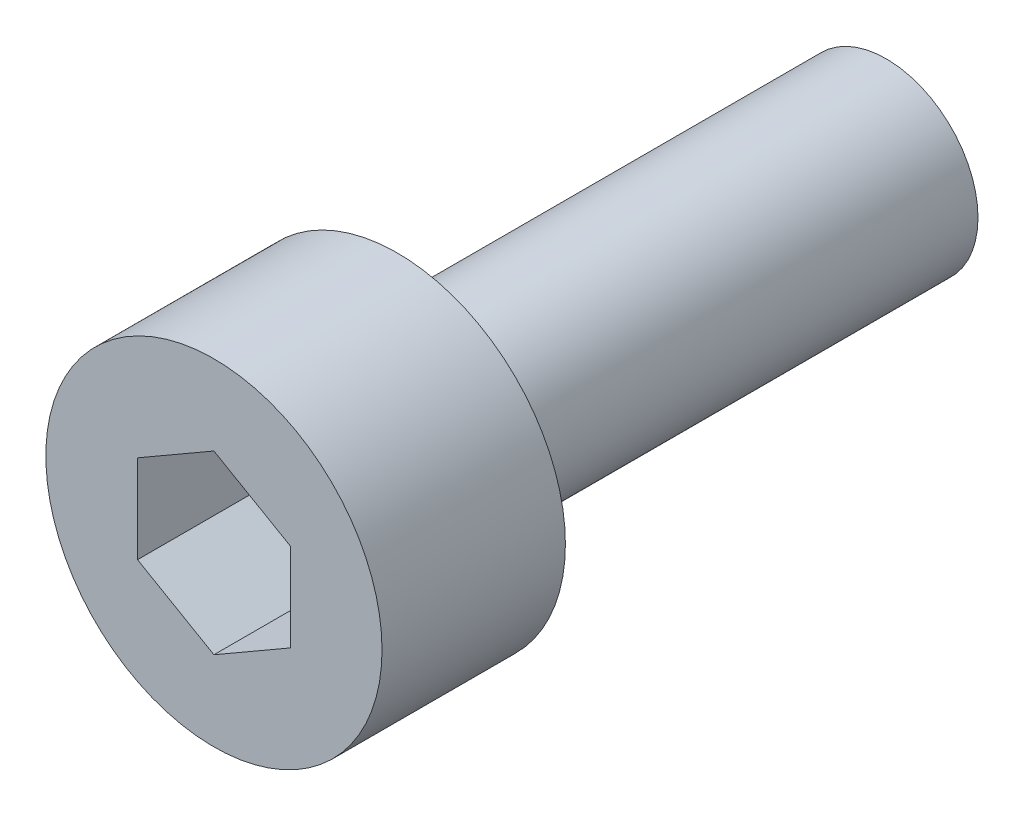
ISO-10303-21;
HEADER;
FILE_DESCRIPTION(('STEP AP214'),'2;1');
FILE_NAME('part.step','',(''),(''),'','','');
FILE_SCHEMA(('AUTOMOTIVE_DESIGN { 1 0 10303 214 1 1 1 1 }'));
ENDSEC;
DATA;
#1=APPLICATION_CONTEXT('core data for automotive mechanical design processes');
#2=APPLICATION_PROTOCOL_DEFINITION('international standard','automotive_design',2000,#1);
#3=PRODUCT_CONTEXT('',#1,'mechanical');
#4=PRODUCT('Part','Part','',(#3));
#5=PRODUCT_RELATED_PRODUCT_CATEGORY('part','',(#4));
#6=PRODUCT_DEFINITION_FORMATION('','',#4);
#7=PRODUCT_DEFINITION_CONTEXT('part definition',#1,'design');
#8=PRODUCT_DEFINITION('design','',#6,#7);
#9=PRODUCT_DEFINITION_SHAPE('','',#8);
#10=(LENGTH_UNIT() NAMED_UNIT(*) SI_UNIT(.MILLI.,.METRE.));
#11=(NAMED_UNIT(*) PLANE_ANGLE_UNIT() SI_UNIT($,.RADIAN.));
#12=(NAMED_UNIT(*) SI_UNIT($,.STERADIAN.) SOLID_ANGLE_UNIT());
#13=UNCERTAINTY_MEASURE_WITH_UNIT(LENGTH_MEASURE(1.E-05),#10,'distance_accuracy_value','');
#14=(GEOMETRIC_REPRESENTATION_CONTEXT(3) GLOBAL_UNCERTAINTY_ASSIGNED_CONTEXT((#13)) GLOBAL_UNIT_ASSIGNED_CONTEXT((#10,
#11,#12)) REPRESENTATION_CONTEXT('',''));
#15=CARTESIAN_POINT('',(0.,0.,0.));
#16=DIRECTION('',(0.,0.,1.));
#17=DIRECTION('',(1.,0.,0.));
#18=AXIS2_PLACEMENT_3D('',#15,#16,#17);
#19=CARTESIAN_POINT('',(0.,0.,0.));
#20=DIRECTION('',(0.,0.,-1.));
#21=DIRECTION('',(-1.,0.,0.));
#22=AXIS2_PLACEMENT_3D('',#19,#20,#21);
#23=CYLINDRICAL_SURFACE('',#22,1.5);
#24=CARTESIAN_POINT('',(0.,0.,0.));
#25=DIRECTION('',(0.,0.,1.));
#26=DIRECTION('',(1.,0.,0.));
#27=AXIS2_PLACEMENT_3D('',#24,#25,#26);
#28=CIRCLE('',#27,1.5);
#29=CARTESIAN_POINT('',(1.5,0.,0.));
#30=VERTEX_POINT('',#29);
#31=EDGE_CURVE('E11',#30,#30,#28,.T.);
#32=ORIENTED_EDGE('',*,*,#31,.F.);
#33=EDGE_LOOP('',(#32));
#34=FACE_BOUND('',#33,.T.);
#35=CARTESIAN_POINT('',(0.,0.,-8.));
#36=DIRECTION('',(0.,0.,1.));
#37=DIRECTION('',(1.,0.,0.));
#38=AXIS2_PLACEMENT_3D('',#35,#36,#37);
#39=CIRCLE('',#38,1.5);
#40=CARTESIAN_POINT('',(1.5,0.,-8.));
#41=VERTEX_POINT('',#40);
#42=EDGE_CURVE('E46',#41,#41,#39,.T.);
#43=ORIENTED_EDGE('',*,*,#42,.T.);
#44=EDGE_LOOP('',(#43));
#45=FACE_BOUND('',#44,.T.);
#46=ADVANCED_FACE('F43',(#34,#45),#23,.T.);
#47=CARTESIAN_POINT('',(0.,0.,-8.));
#48=DIRECTION('',(0.,0.,1.));
#49=DIRECTION('',(1.,0.,0.));
#50=AXIS2_PLACEMENT_3D('',#47,#48,#49);
#51=PLANE('',#50);
#52=ORIENTED_EDGE('',*,*,#42,.F.);
#53=EDGE_LOOP('',(#52));
#54=FACE_BOUND('',#53,.T.);
#55=ADVANCED_FACE('F164',(#54),#51,.F.);
#56=CARTESIAN_POINT('',(0.,0.,3.));
#57=DIRECTION('',(0.,0.,1.));
#58=DIRECTION('',(1.,0.,0.));
#59=AXIS2_PLACEMENT_3D('',#56,#57,#58);
#60=PLANE('',#59);
#61=CARTESIAN_POINT('',(0.,0.,3.));
#62=DIRECTION('',(0.,0.,1.));
#63=DIRECTION('',(1.,0.,0.));
#64=AXIS2_PLACEMENT_3D('',#61,#62,#63);
#65=CIRCLE('',#64,2.75);
#66=CARTESIAN_POINT('',(2.75,0.,3.));
#67=VERTEX_POINT('',#66);
#68=EDGE_CURVE('E146',#67,#67,#65,.T.);
#69=ORIENTED_EDGE('',*,*,#68,.T.);
#70=EDGE_LOOP('',(#69));
#71=FACE_BOUND('',#70,.T.);
#72=DIRECTION('',(-0.866025403784439,0.5,0.));
#73=VECTOR('',#72,1.);
#74=CARTESIAN_POINT('',(1.25,0.721687836487032,3.));
#75=LINE('',#74,#73);
#76=CARTESIAN_POINT('',(1.25,0.721687836487032,3.));
#77=VERTEX_POINT('',#76);
#78=CARTESIAN_POINT('',(0.,1.44337567297406,3.));
#79=VERTEX_POINT('',#78);
#80=EDGE_CURVE('E103',#77,#79,#75,.T.);
#81=ORIENTED_EDGE('',*,*,#80,.F.);
#82=DIRECTION('',(0.,1.,0.));
#83=VECTOR('',#82,1.);
#84=CARTESIAN_POINT('',(1.25,-0.721687836487033,3.));
#85=LINE('',#84,#83);
#86=CARTESIAN_POINT('',(1.25,-0.721687836487033,3.));
#87=VERTEX_POINT('',#86);
#88=EDGE_CURVE('E94',#87,#77,#85,.T.);
#89=ORIENTED_EDGE('',*,*,#88,.F.);
#90=DIRECTION('',(0.866025403784439,0.5,0.));
#91=VECTOR('',#90,1.);
#92=CARTESIAN_POINT('',(0.,-1.44337567297406,3.));
#93=LINE('',#92,#91);
#94=CARTESIAN_POINT('',(0.,-1.44337567297406,3.));
#95=VERTEX_POINT('',#94);
#96=EDGE_CURVE('E124',#95,#87,#93,.T.);
#97=ORIENTED_EDGE('',*,*,#96,.F.);
#98=DIRECTION('',(0.866025403784439,-0.5,0.));
#99=VECTOR('',#98,1.);
#100=CARTESIAN_POINT('',(-1.25,-0.721687836487032,3.));
#101=LINE('',#100,#99);
#102=CARTESIAN_POINT('',(-1.25,-0.721687836487032,3.));
#103=VERTEX_POINT('',#102);
#104=EDGE_CURVE('E121',#103,#95,#101,.T.);
#105=ORIENTED_EDGE('',*,*,#104,.F.);
#106=DIRECTION('',(0.,-1.,0.));
#107=VECTOR('',#106,1.);
#108=CARTESIAN_POINT('',(-1.25,0.721687836487032,3.));
#109=LINE('',#108,#107);
#110=CARTESIAN_POINT('',(-1.25,0.721687836487032,3.));
#111=VERTEX_POINT('',#110);
#112=EDGE_CURVE('E117',#111,#103,#109,.T.);
#113=ORIENTED_EDGE('',*,*,#112,.F.);
#114=DIRECTION('',(-0.866025403784439,-0.5,0.));
#115=VECTOR('',#114,1.);
#116=CARTESIAN_POINT('',(0.,1.44337567297406,3.));
#117=LINE('',#116,#115);
#118=EDGE_CURVE('E115',#79,#111,#117,.T.);
#119=ORIENTED_EDGE('',*,*,#118,.F.);
#120=EDGE_LOOP('',(#81,#89,#97,#105,#113,#119));
#121=FACE_BOUND('',#120,.T.);
#122=ADVANCED_FACE('F113',(#71,#121),#60,.T.);
#123=CARTESIAN_POINT('',(0.,0.,0.));
#124=DIRECTION('',(0.,0.,1.));
#125=DIRECTION('',(1.,0.,0.));
#126=AXIS2_PLACEMENT_3D('',#123,#124,#125);
#127=PLANE('',#126);
#128=ORIENTED_EDGE('',*,*,#31,.T.);
#129=EDGE_LOOP('',(#128));
#130=FACE_BOUND('',#129,.T.);
#131=CARTESIAN_POINT('',(0.,0.,0.));
#132=DIRECTION('',(0.,0.,1.));
#133=DIRECTION('',(1.,0.,0.));
#134=AXIS2_PLACEMENT_3D('',#131,#132,#133);
#135=CIRCLE('',#134,2.75);
#136=CARTESIAN_POINT('',(2.75,0.,0.));
#137=VERTEX_POINT('',#136);
#138=EDGE_CURVE('E109',#137,#137,#135,.T.);
#139=ORIENTED_EDGE('',*,*,#138,.F.);
#140=EDGE_LOOP('',(#139));
#141=FACE_BOUND('',#140,.T.);
#142=ADVANCED_FACE('F154',(#130,#141),#127,.F.);
#143=CARTESIAN_POINT('',(0.,0.,3.));
#144=DIRECTION('',(0.,0.,-1.));
#145=DIRECTION('',(-1.,0.,0.));
#146=AXIS2_PLACEMENT_3D('',#143,#144,#145);
#147=CYLINDRICAL_SURFACE('',#146,2.75);
#148=ORIENTED_EDGE('',*,*,#68,.F.);
#149=EDGE_LOOP('',(#148));
#150=FACE_BOUND('',#149,.T.);
#151=ORIENTED_EDGE('',*,*,#138,.T.);
#152=EDGE_LOOP('',(#151));
#153=FACE_BOUND('',#152,.T.);
#154=ADVANCED_FACE('F152',(#150,#153),#147,.T.);
#155=CARTESIAN_POINT('',(1.25,-0.721687836487033,3.));
#156=DIRECTION('',(-1.,0.,0.));
#157=DIRECTION('',(0.,-1.,0.));
#158=AXIS2_PLACEMENT_3D('',#155,#156,#157);
#159=PLANE('',#158);
#160=DIRECTION('',(0.,1.,0.));
#161=VECTOR('',#160,1.);
#162=CARTESIAN_POINT('',(1.25,-0.721687836487033,0.));
#163=LINE('',#162,#161);
#164=CARTESIAN_POINT('',(1.25,-0.721687836487033,0.));
#165=VERTEX_POINT('',#164);
#166=CARTESIAN_POINT('',(1.25,0.721687836487032,0.));
#167=VERTEX_POINT('',#166);
#168=EDGE_CURVE('E57',#165,#167,#163,.T.);
#169=ORIENTED_EDGE('',*,*,#168,.F.);
#170=DIRECTION('',(0.,0.,-1.));
#171=VECTOR('',#170,1.);
#172=CARTESIAN_POINT('',(1.25,-0.721687836487033,3.));
#173=LINE('',#172,#171);
#174=EDGE_CURVE('E99',#87,#165,#173,.T.);
#175=ORIENTED_EDGE('',*,*,#174,.F.);
#176=ORIENTED_EDGE('',*,*,#88,.T.);
#177=DIRECTION('',(0.,0.,-1.));
#178=VECTOR('',#177,1.);
#179=CARTESIAN_POINT('',(1.25,0.721687836487032,3.));
#180=LINE('',#179,#178);
#181=EDGE_CURVE('E97',#77,#167,#180,.T.);
#182=ORIENTED_EDGE('',*,*,#181,.T.);
#183=EDGE_LOOP('',(#169,#175,#176,#182));
#184=FACE_BOUND('',#183,.T.);
#185=ADVANCED_FACE('F96',(#184),#159,.T.);
#186=CARTESIAN_POINT('',(1.25,0.721687836487032,3.));
#187=DIRECTION('',(-0.5,-0.866025403784439,0.));
#188=DIRECTION('',(0.866025403784439,-0.5,0.));
#189=AXIS2_PLACEMENT_3D('',#186,#187,#188);
#190=PLANE('',#189);
#191=DIRECTION('',(-0.866025403784439,0.5,0.));
#192=VECTOR('',#191,1.);
#193=CARTESIAN_POINT('',(1.25,0.721687836487032,0.));
#194=LINE('',#193,#192);
#195=CARTESIAN_POINT('',(0.,1.44337567297406,0.));
#196=VERTEX_POINT('',#195);
#197=EDGE_CURVE('E61',#167,#196,#194,.T.);
#198=ORIENTED_EDGE('',*,*,#197,.F.);
#199=ORIENTED_EDGE('',*,*,#181,.F.);
#200=ORIENTED_EDGE('',*,*,#80,.T.);
#201=DIRECTION('',(0.,0.,-1.));
#202=VECTOR('',#201,1.);
#203=CARTESIAN_POINT('',(0.,1.44337567297406,3.));
#204=LINE('',#203,#202);
#205=EDGE_CURVE('E110',#79,#196,#204,.T.);
#206=ORIENTED_EDGE('',*,*,#205,.T.);
#207=EDGE_LOOP('',(#198,#199,#200,#206));
#208=FACE_BOUND('',#207,.T.);
#209=ADVANCED_FACE('F107',(#208),#190,.T.);
#210=CARTESIAN_POINT('',(0.,1.44337567297406,3.));
#211=DIRECTION('',(0.5,-0.866025403784439,0.));
#212=DIRECTION('',(0.866025403784439,0.5,0.));
#213=AXIS2_PLACEMENT_3D('',#210,#211,#212);
#214=PLANE('',#213);
#215=DIRECTION('',(-0.866025403784439,-0.5,0.));
#216=VECTOR('',#215,1.);
#217=CARTESIAN_POINT('',(0.,1.44337567297406,0.));
#218=LINE('',#217,#216);
#219=CARTESIAN_POINT('',(-1.25,0.721687836487032,0.));
#220=VERTEX_POINT('',#219);
#221=EDGE_CURVE('E128',#196,#220,#218,.T.);
#222=ORIENTED_EDGE('',*,*,#221,.F.);
#223=ORIENTED_EDGE('',*,*,#205,.F.);
#224=ORIENTED_EDGE('',*,*,#118,.T.);
#225=DIRECTION('',(0.,0.,-1.));
#226=VECTOR('',#225,1.);
#227=CARTESIAN_POINT('',(-1.25,0.721687836487032,3.));
#228=LINE('',#227,#226);
#229=EDGE_CURVE('E142',#111,#220,#228,.T.);
#230=ORIENTED_EDGE('',*,*,#229,.T.);
#231=EDGE_LOOP('',(#222,#223,#224,#230));
#232=FACE_BOUND('',#231,.T.);
#233=ADVANCED_FACE('F199',(#232),#214,.T.);
#234=CARTESIAN_POINT('',(-1.25,0.721687836487032,3.));
#235=DIRECTION('',(1.,0.,0.));
#236=DIRECTION('',(0.,1.,0.));
#237=AXIS2_PLACEMENT_3D('',#234,#235,#236);
#238=PLANE('',#237);
#239=DIRECTION('',(0.,-1.,0.));
#240=VECTOR('',#239,1.);
#241=CARTESIAN_POINT('',(-1.25,0.721687836487032,0.));
#242=LINE('',#241,#240);
#243=CARTESIAN_POINT('',(-1.25,-0.721687836487033,0.));
#244=VERTEX_POINT('',#243);
#245=EDGE_CURVE('E130',#220,#244,#242,.T.);
#246=ORIENTED_EDGE('',*,*,#245,.F.);
#247=ORIENTED_EDGE('',*,*,#229,.F.);
#248=ORIENTED_EDGE('',*,*,#112,.T.);
#249=DIRECTION('',(0.,0.,-1.));
#250=VECTOR('',#249,1.);
#251=CARTESIAN_POINT('',(-1.25,-0.721687836487032,3.));
#252=LINE('',#251,#250);
#253=EDGE_CURVE('E139',#103,#244,#252,.T.);
#254=ORIENTED_EDGE('',*,*,#253,.T.);
#255=EDGE_LOOP('',(#246,#247,#248,#254));
#256=FACE_BOUND('',#255,.T.);
#257=ADVANCED_FACE('F192',(#256),#238,.T.);
#258=CARTESIAN_POINT('',(-1.25,-0.721687836487032,3.));
#259=DIRECTION('',(0.5,0.866025403784439,0.));
#260=DIRECTION('',(-0.866025403784439,0.5,0.));
#261=AXIS2_PLACEMENT_3D('',#258,#259,#260);
#262=PLANE('',#261);
#263=DIRECTION('',(0.866025403784439,-0.5,0.));
#264=VECTOR('',#263,1.);
#265=CARTESIAN_POINT('',(-1.25,-0.721687836487032,0.));
#266=LINE('',#265,#264);
#267=CARTESIAN_POINT('',(0.,-1.44337567297406,0.));
#268=VERTEX_POINT('',#267);
#269=EDGE_CURVE('E132',#244,#268,#266,.T.);
#270=ORIENTED_EDGE('',*,*,#269,.F.);
#271=ORIENTED_EDGE('',*,*,#253,.F.);
#272=ORIENTED_EDGE('',*,*,#104,.T.);
#273=DIRECTION('',(0.,0.,-1.));
#274=VECTOR('',#273,1.);
#275=CARTESIAN_POINT('',(0.,-1.44337567297406,3.));
#276=LINE('',#275,#274);
#277=EDGE_CURVE('E136',#95,#268,#276,.T.);
#278=ORIENTED_EDGE('',*,*,#277,.T.);
#279=EDGE_LOOP('',(#270,#271,#272,#278));
#280=FACE_BOUND('',#279,.T.);
#281=ADVANCED_FACE('F186',(#280),#262,.T.);
#282=CARTESIAN_POINT('',(0.,-1.44337567297406,3.));
#283=DIRECTION('',(-0.5,0.866025403784439,0.));
#284=DIRECTION('',(-0.866025403784439,-0.5,0.));
#285=AXIS2_PLACEMENT_3D('',#282,#283,#284);
#286=PLANE('',#285);
#287=DIRECTION('',(0.866025403784439,0.5,0.));
#288=VECTOR('',#287,1.);
#289=CARTESIAN_POINT('',(0.,-1.44337567297406,0.));
#290=LINE('',#289,#288);
#291=EDGE_CURVE('E104',#268,#165,#290,.T.);
#292=ORIENTED_EDGE('',*,*,#291,.F.);
#293=ORIENTED_EDGE('',*,*,#277,.F.);
#294=ORIENTED_EDGE('',*,*,#96,.T.);
#295=ORIENTED_EDGE('',*,*,#174,.T.);
#296=EDGE_LOOP('',(#292,#293,#294,#295));
#297=FACE_BOUND('',#296,.T.);
#298=ADVANCED_FACE('F182',(#297),#286,.T.);
#299=CARTESIAN_POINT('',(0.,0.,0.));
#300=DIRECTION('',(0.,0.,1.));
#301=DIRECTION('',(1.,0.,0.));
#302=AXIS2_PLACEMENT_3D('',#299,#300,#301);
#303=PLANE('',#302);
#304=ORIENTED_EDGE('',*,*,#168,.T.);
#305=ORIENTED_EDGE('',*,*,#197,.T.);
#306=ORIENTED_EDGE('',*,*,#221,.T.);
#307=ORIENTED_EDGE('',*,*,#245,.T.);
#308=ORIENTED_EDGE('',*,*,#269,.T.);
#309=ORIENTED_EDGE('',*,*,#291,.T.);
#310=EDGE_LOOP('',(#304,#305,#306,#307,#308,#309));
#311=FACE_BOUND('',#310,.T.);
#312=ADVANCED_FACE('F180',(#311),#303,.T.);
#313=CLOSED_SHELL('',(#46,#55,#122,#142,#154,#185,#209,#233,#257,#281,#298,#312));
#314=MANIFOLD_SOLID_BREP('B2',#313);
#315=ADVANCED_BREP_SHAPE_REPRESENTATION('',(#18,#314),#14);
#316=SHAPE_DEFINITION_REPRESENTATION(#9,#315);
ENDSEC;
END-ISO-10303-21;
